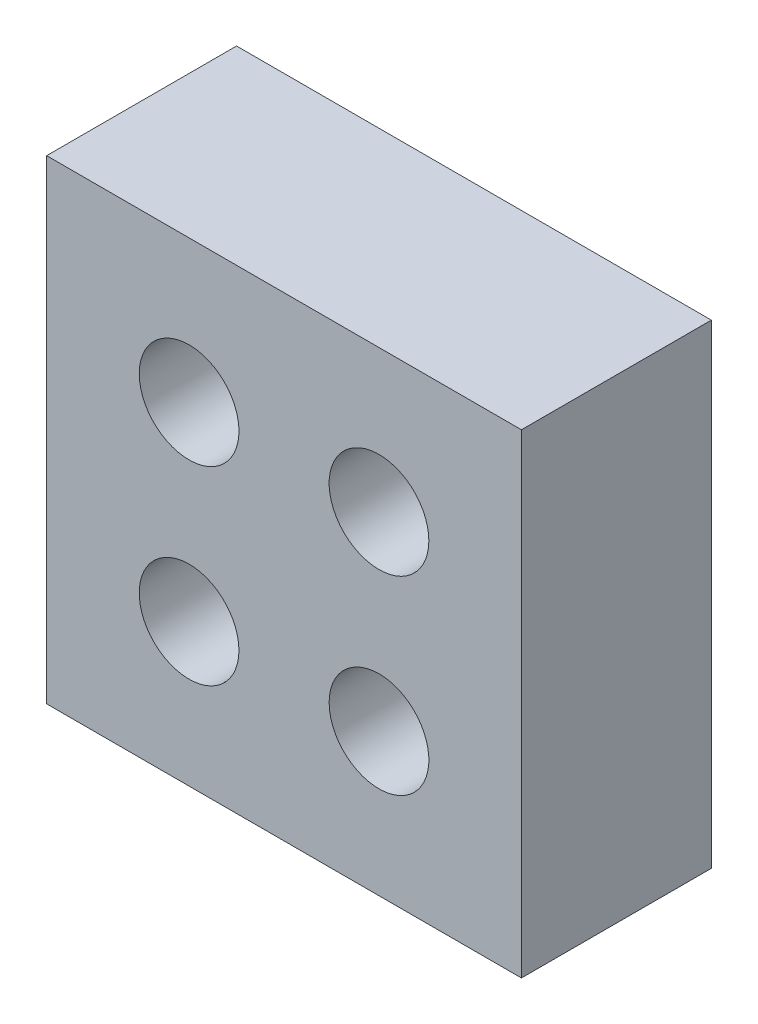
ISO-10303-21;
HEADER;
FILE_DESCRIPTION(('STEP AP214'),'2;1');
FILE_NAME('part.step','',(''),(''),'','','');
FILE_SCHEMA(('AUTOMOTIVE_DESIGN { 1 0 10303 214 1 1 1 1 }'));
ENDSEC;
DATA;
#1=APPLICATION_CONTEXT('core data for automotive mechanical design processes');
#2=APPLICATION_PROTOCOL_DEFINITION('international standard','automotive_design',2000,#1);
#3=PRODUCT_CONTEXT('',#1,'mechanical');
#4=PRODUCT('Part','Part','',(#3));
#5=PRODUCT_RELATED_PRODUCT_CATEGORY('part','',(#4));
#6=PRODUCT_DEFINITION_FORMATION('','',#4);
#7=PRODUCT_DEFINITION_CONTEXT('part definition',#1,'design');
#8=PRODUCT_DEFINITION('design','',#6,#7);
#9=PRODUCT_DEFINITION_SHAPE('','',#8);
#10=(LENGTH_UNIT() NAMED_UNIT(*) SI_UNIT(.MILLI.,.METRE.));
#11=(NAMED_UNIT(*) PLANE_ANGLE_UNIT() SI_UNIT($,.RADIAN.));
#12=(NAMED_UNIT(*) SI_UNIT($,.STERADIAN.) SOLID_ANGLE_UNIT());
#13=UNCERTAINTY_MEASURE_WITH_UNIT(LENGTH_MEASURE(1.E-05),#10,'distance_accuracy_value','');
#14=(GEOMETRIC_REPRESENTATION_CONTEXT(3) GLOBAL_UNCERTAINTY_ASSIGNED_CONTEXT((#13)) GLOBAL_UNIT_ASSIGNED_CONTEXT((#10,
#11,#12)) REPRESENTATION_CONTEXT('',''));
#15=CARTESIAN_POINT('',(0.,0.,0.));
#16=DIRECTION('',(0.,0.,1.));
#17=DIRECTION('',(1.,0.,0.));
#18=AXIS2_PLACEMENT_3D('',#15,#16,#17);
#19=CARTESIAN_POINT('',(0.,0.,6.));
#20=DIRECTION('',(1.,0.,0.));
#21=DIRECTION('',(0.,1.,0.));
#22=AXIS2_PLACEMENT_3D('',#19,#20,#21);
#23=PLANE('',#22);
#24=DIRECTION('',(0.,-1.,0.));
#25=VECTOR('',#24,1.);
#26=CARTESIAN_POINT('',(0.,0.,0.));
#27=LINE('',#26,#25);
#28=CARTESIAN_POINT('',(0.,0.,0.));
#29=VERTEX_POINT('',#28);
#30=CARTESIAN_POINT('',(0.,-15.,0.));
#31=VERTEX_POINT('',#30);
#32=EDGE_CURVE('E111',#29,#31,#27,.T.);
#33=ORIENTED_EDGE('',*,*,#32,.T.);
#34=DIRECTION('',(0.,0.,-1.));
#35=VECTOR('',#34,1.);
#36=CARTESIAN_POINT('',(0.,-15.,6.));
#37=LINE('',#36,#35);
#38=CARTESIAN_POINT('',(0.,-15.,6.));
#39=VERTEX_POINT('',#38);
#40=EDGE_CURVE('E11',#39,#31,#37,.T.);
#41=ORIENTED_EDGE('',*,*,#40,.F.);
#42=DIRECTION('',(0.,-1.,0.));
#43=VECTOR('',#42,1.);
#44=CARTESIAN_POINT('',(0.,0.,6.));
#45=LINE('',#44,#43);
#46=CARTESIAN_POINT('',(0.,0.,6.));
#47=VERTEX_POINT('',#46);
#48=EDGE_CURVE('E95',#47,#39,#45,.T.);
#49=ORIENTED_EDGE('',*,*,#48,.F.);
#50=DIRECTION('',(0.,0.,-1.));
#51=VECTOR('',#50,1.);
#52=CARTESIAN_POINT('',(0.,0.,6.));
#53=LINE('',#52,#51);
#54=EDGE_CURVE('E107',#47,#29,#53,.T.);
#55=ORIENTED_EDGE('',*,*,#54,.T.);
#56=EDGE_LOOP('',(#33,#41,#49,#55));
#57=FACE_BOUND('',#56,.T.);
#58=ADVANCED_FACE('F43',(#57),#23,.F.);
#59=CARTESIAN_POINT('',(0.,-15.,6.));
#60=DIRECTION('',(0.,1.,0.));
#61=DIRECTION('',(0.,0.,1.));
#62=AXIS2_PLACEMENT_3D('',#59,#60,#61);
#63=PLANE('',#62);
#64=DIRECTION('',(1.,0.,0.));
#65=VECTOR('',#64,1.);
#66=CARTESIAN_POINT('',(0.,-15.,0.));
#67=LINE('',#66,#65);
#68=CARTESIAN_POINT('',(15.,-15.,0.));
#69=VERTEX_POINT('',#68);
#70=EDGE_CURVE('E100',#31,#69,#67,.T.);
#71=ORIENTED_EDGE('',*,*,#70,.T.);
#72=DIRECTION('',(0.,0.,-1.));
#73=VECTOR('',#72,1.);
#74=CARTESIAN_POINT('',(15.,-15.,6.));
#75=LINE('',#74,#73);
#76=CARTESIAN_POINT('',(15.,-15.,6.));
#77=VERTEX_POINT('',#76);
#78=EDGE_CURVE('E52',#77,#69,#75,.T.);
#79=ORIENTED_EDGE('',*,*,#78,.F.);
#80=DIRECTION('',(1.,0.,0.));
#81=VECTOR('',#80,1.);
#82=CARTESIAN_POINT('',(0.,-15.,6.));
#83=LINE('',#82,#81);
#84=EDGE_CURVE('E90',#39,#77,#83,.T.);
#85=ORIENTED_EDGE('',*,*,#84,.F.);
#86=ORIENTED_EDGE('',*,*,#40,.T.);
#87=EDGE_LOOP('',(#71,#79,#85,#86));
#88=FACE_BOUND('',#87,.T.);
#89=ADVANCED_FACE('F99',(#88),#63,.F.);
#90=CARTESIAN_POINT('',(15.,0.,6.));
#91=DIRECTION('',(-1.,0.,0.));
#92=DIRECTION('',(0.,-1.,0.));
#93=AXIS2_PLACEMENT_3D('',#90,#91,#92);
#94=PLANE('',#93);
#95=DIRECTION('',(0.,1.,0.));
#96=VECTOR('',#95,1.);
#97=CARTESIAN_POINT('',(15.,0.,0.));
#98=LINE('',#97,#96);
#99=CARTESIAN_POINT('',(15.,0.,0.));
#100=VERTEX_POINT('',#99);
#101=EDGE_CURVE('E77',#69,#100,#98,.T.);
#102=ORIENTED_EDGE('',*,*,#101,.T.);
#103=DIRECTION('',(0.,0.,-1.));
#104=VECTOR('',#103,1.);
#105=CARTESIAN_POINT('',(15.,0.,6.));
#106=LINE('',#105,#104);
#107=CARTESIAN_POINT('',(15.,0.,6.));
#108=VERTEX_POINT('',#107);
#109=EDGE_CURVE('E102',#108,#100,#106,.T.);
#110=ORIENTED_EDGE('',*,*,#109,.F.);
#111=DIRECTION('',(0.,1.,0.));
#112=VECTOR('',#111,1.);
#113=CARTESIAN_POINT('',(15.,0.,6.));
#114=LINE('',#113,#112);
#115=EDGE_CURVE('E93',#77,#108,#114,.T.);
#116=ORIENTED_EDGE('',*,*,#115,.F.);
#117=ORIENTED_EDGE('',*,*,#78,.T.);
#118=EDGE_LOOP('',(#102,#110,#116,#117));
#119=FACE_BOUND('',#118,.T.);
#120=ADVANCED_FACE('F103',(#119),#94,.F.);
#121=CARTESIAN_POINT('',(0.,0.,6.));
#122=DIRECTION('',(0.,-1.,0.));
#123=DIRECTION('',(0.,0.,-1.));
#124=AXIS2_PLACEMENT_3D('',#121,#122,#123);
#125=PLANE('',#124);
#126=DIRECTION('',(-1.,0.,0.));
#127=VECTOR('',#126,1.);
#128=CARTESIAN_POINT('',(0.,0.,0.));
#129=LINE('',#128,#127);
#130=EDGE_CURVE('E83',#100,#29,#129,.T.);
#131=ORIENTED_EDGE('',*,*,#130,.T.);
#132=ORIENTED_EDGE('',*,*,#54,.F.);
#133=DIRECTION('',(-1.,0.,0.));
#134=VECTOR('',#133,1.);
#135=CARTESIAN_POINT('',(0.,0.,6.));
#136=LINE('',#135,#134);
#137=EDGE_CURVE('E60',#108,#47,#136,.T.);
#138=ORIENTED_EDGE('',*,*,#137,.F.);
#139=ORIENTED_EDGE('',*,*,#109,.T.);
#140=EDGE_LOOP('',(#131,#132,#138,#139));
#141=FACE_BOUND('',#140,.T.);
#142=ADVANCED_FACE('F125',(#141),#125,.F.);
#143=CARTESIAN_POINT('',(0.,0.,6.));
#144=DIRECTION('',(0.,0.,1.));
#145=DIRECTION('',(1.,0.,0.));
#146=AXIS2_PLACEMENT_3D('',#143,#144,#145);
#147=PLANE('',#146);
#148=CARTESIAN_POINT('',(4.5,-4.5,6.));
#149=DIRECTION('',(0.,0.,1.));
#150=DIRECTION('',(-1.,0.,0.));
#151=AXIS2_PLACEMENT_3D('',#148,#149,#150);
#152=CIRCLE('',#151,1.575);
#153=CARTESIAN_POINT('',(2.925,-4.5,6.));
#154=VERTEX_POINT('',#153);
#155=EDGE_CURVE('E144',#154,#154,#152,.T.);
#156=ORIENTED_EDGE('',*,*,#155,.F.);
#157=EDGE_LOOP('',(#156));
#158=FACE_BOUND('',#157,.T.);
#159=CARTESIAN_POINT('',(10.5,-4.5,6.));
#160=DIRECTION('',(0.,0.,1.));
#161=DIRECTION('',(1.,0.,0.));
#162=AXIS2_PLACEMENT_3D('',#159,#160,#161);
#163=CIRCLE('',#162,1.575);
#164=CARTESIAN_POINT('',(12.075,-4.5,6.));
#165=VERTEX_POINT('',#164);
#166=EDGE_CURVE('E152',#165,#165,#163,.T.);
#167=ORIENTED_EDGE('',*,*,#166,.F.);
#168=EDGE_LOOP('',(#167));
#169=FACE_BOUND('',#168,.T.);
#170=CARTESIAN_POINT('',(10.5,-10.5,6.));
#171=DIRECTION('',(0.,0.,1.));
#172=DIRECTION('',(-1.,0.,0.));
#173=AXIS2_PLACEMENT_3D('',#170,#171,#172);
#174=CIRCLE('',#173,1.575);
#175=CARTESIAN_POINT('',(8.925,-10.5,6.));
#176=VERTEX_POINT('',#175);
#177=EDGE_CURVE('E136',#176,#176,#174,.T.);
#178=ORIENTED_EDGE('',*,*,#177,.F.);
#179=EDGE_LOOP('',(#178));
#180=FACE_BOUND('',#179,.T.);
#181=CARTESIAN_POINT('',(4.5,-10.5,6.));
#182=DIRECTION('',(0.,0.,1.));
#183=DIRECTION('',(1.,0.,0.));
#184=AXIS2_PLACEMENT_3D('',#181,#182,#183);
#185=CIRCLE('',#184,1.575);
#186=CARTESIAN_POINT('',(6.075,-10.5,6.));
#187=VERTEX_POINT('',#186);
#188=EDGE_CURVE('E132',#187,#187,#185,.T.);
#189=ORIENTED_EDGE('',*,*,#188,.F.);
#190=EDGE_LOOP('',(#189));
#191=FACE_BOUND('',#190,.T.);
#192=ORIENTED_EDGE('',*,*,#48,.T.);
#193=ORIENTED_EDGE('',*,*,#84,.T.);
#194=ORIENTED_EDGE('',*,*,#115,.T.);
#195=ORIENTED_EDGE('',*,*,#137,.T.);
#196=EDGE_LOOP('',(#192,#193,#194,#195));
#197=FACE_BOUND('',#196,.T.);
#198=ADVANCED_FACE('F91',(#158,#169,#180,#191,#197),#147,.T.);
#199=CARTESIAN_POINT('',(0.,0.,0.));
#200=DIRECTION('',(0.,0.,1.));
#201=DIRECTION('',(1.,0.,0.));
#202=AXIS2_PLACEMENT_3D('',#199,#200,#201);
#203=PLANE('',#202);
#204=CARTESIAN_POINT('',(4.5,-4.5,0.));
#205=DIRECTION('',(0.,0.,1.));
#206=DIRECTION('',(-1.,0.,0.));
#207=AXIS2_PLACEMENT_3D('',#204,#205,#206);
#208=CIRCLE('',#207,1.575);
#209=CARTESIAN_POINT('',(2.925,-4.5,0.));
#210=VERTEX_POINT('',#209);
#211=EDGE_CURVE('E140',#210,#210,#208,.T.);
#212=ORIENTED_EDGE('',*,*,#211,.T.);
#213=EDGE_LOOP('',(#212));
#214=FACE_BOUND('',#213,.T.);
#215=CARTESIAN_POINT('',(10.5,-4.5,0.));
#216=DIRECTION('',(0.,0.,1.));
#217=DIRECTION('',(1.,0.,0.));
#218=AXIS2_PLACEMENT_3D('',#215,#216,#217);
#219=CIRCLE('',#218,1.575);
#220=CARTESIAN_POINT('',(12.075,-4.5,0.));
#221=VERTEX_POINT('',#220);
#222=EDGE_CURVE('E148',#221,#221,#219,.T.);
#223=ORIENTED_EDGE('',*,*,#222,.T.);
#224=EDGE_LOOP('',(#223));
#225=FACE_BOUND('',#224,.T.);
#226=CARTESIAN_POINT('',(10.5,-10.5,0.));
#227=DIRECTION('',(0.,0.,1.));
#228=DIRECTION('',(-1.,0.,0.));
#229=AXIS2_PLACEMENT_3D('',#226,#227,#228);
#230=CIRCLE('',#229,1.575);
#231=CARTESIAN_POINT('',(8.925,-10.5,0.));
#232=VERTEX_POINT('',#231);
#233=EDGE_CURVE('E156',#232,#232,#230,.T.);
#234=ORIENTED_EDGE('',*,*,#233,.T.);
#235=EDGE_LOOP('',(#234));
#236=FACE_BOUND('',#235,.T.);
#237=CARTESIAN_POINT('',(4.5,-10.5,0.));
#238=DIRECTION('',(0.,0.,1.));
#239=DIRECTION('',(1.,0.,0.));
#240=AXIS2_PLACEMENT_3D('',#237,#238,#239);
#241=CIRCLE('',#240,1.575);
#242=CARTESIAN_POINT('',(6.075,-10.5,0.));
#243=VERTEX_POINT('',#242);
#244=EDGE_CURVE('E115',#243,#243,#241,.T.);
#245=ORIENTED_EDGE('',*,*,#244,.T.);
#246=EDGE_LOOP('',(#245));
#247=FACE_BOUND('',#246,.T.);
#248=ORIENTED_EDGE('',*,*,#32,.F.);
#249=ORIENTED_EDGE('',*,*,#130,.F.);
#250=ORIENTED_EDGE('',*,*,#101,.F.);
#251=ORIENTED_EDGE('',*,*,#70,.F.);
#252=EDGE_LOOP('',(#248,#249,#250,#251));
#253=FACE_BOUND('',#252,.T.);
#254=ADVANCED_FACE('F128',(#214,#225,#236,#247,#253),#203,.F.);
#255=CARTESIAN_POINT('',(4.5,-10.5,0.));
#256=DIRECTION('',(0.,0.,1.));
#257=DIRECTION('',(1.,0.,0.));
#258=AXIS2_PLACEMENT_3D('',#255,#256,#257);
#259=CYLINDRICAL_SURFACE('',#258,1.575);
#260=ORIENTED_EDGE('',*,*,#244,.F.);
#261=EDGE_LOOP('',(#260));
#262=FACE_BOUND('',#261,.T.);
#263=ORIENTED_EDGE('',*,*,#188,.T.);
#264=EDGE_LOOP('',(#263));
#265=FACE_BOUND('',#264,.T.);
#266=ADVANCED_FACE('F172',(#262,#265),#259,.F.);
#267=CARTESIAN_POINT('',(10.5,-10.5,0.));
#268=DIRECTION('',(0.,0.,1.));
#269=DIRECTION('',(1.,0.,0.));
#270=AXIS2_PLACEMENT_3D('',#267,#268,#269);
#271=CYLINDRICAL_SURFACE('',#270,1.575);
#272=ORIENTED_EDGE('',*,*,#233,.F.);
#273=EDGE_LOOP('',(#272));
#274=FACE_BOUND('',#273,.T.);
#275=ORIENTED_EDGE('',*,*,#177,.T.);
#276=EDGE_LOOP('',(#275));
#277=FACE_BOUND('',#276,.T.);
#278=ADVANCED_FACE('F164',(#274,#277),#271,.F.);
#279=CARTESIAN_POINT('',(10.5,-4.5,0.));
#280=DIRECTION('',(0.,0.,1.));
#281=DIRECTION('',(1.,0.,0.));
#282=AXIS2_PLACEMENT_3D('',#279,#280,#281);
#283=CYLINDRICAL_SURFACE('',#282,1.575);
#284=ORIENTED_EDGE('',*,*,#222,.F.);
#285=EDGE_LOOP('',(#284));
#286=FACE_BOUND('',#285,.T.);
#287=ORIENTED_EDGE('',*,*,#166,.T.);
#288=EDGE_LOOP('',(#287));
#289=FACE_BOUND('',#288,.T.);
#290=ADVANCED_FACE('F180',(#286,#289),#283,.F.);
#291=CARTESIAN_POINT('',(4.5,-4.5,0.));
#292=DIRECTION('',(0.,0.,1.));
#293=DIRECTION('',(1.,0.,0.));
#294=AXIS2_PLACEMENT_3D('',#291,#292,#293);
#295=CYLINDRICAL_SURFACE('',#294,1.575);
#296=ORIENTED_EDGE('',*,*,#211,.F.);
#297=EDGE_LOOP('',(#296));
#298=FACE_BOUND('',#297,.T.);
#299=ORIENTED_EDGE('',*,*,#155,.T.);
#300=EDGE_LOOP('',(#299));
#301=FACE_BOUND('',#300,.T.);
#302=ADVANCED_FACE('F231',(#298,#301),#295,.F.);
#303=CLOSED_SHELL('',(#58,#89,#120,#142,#198,#254,#266,#278,#290,#302));
#304=MANIFOLD_SOLID_BREP('B2',#303);
#305=ADVANCED_BREP_SHAPE_REPRESENTATION('',(#18,#304),#14);
#306=SHAPE_DEFINITION_REPRESENTATION(#9,#305);
ENDSEC;
END-ISO-10303-21;
